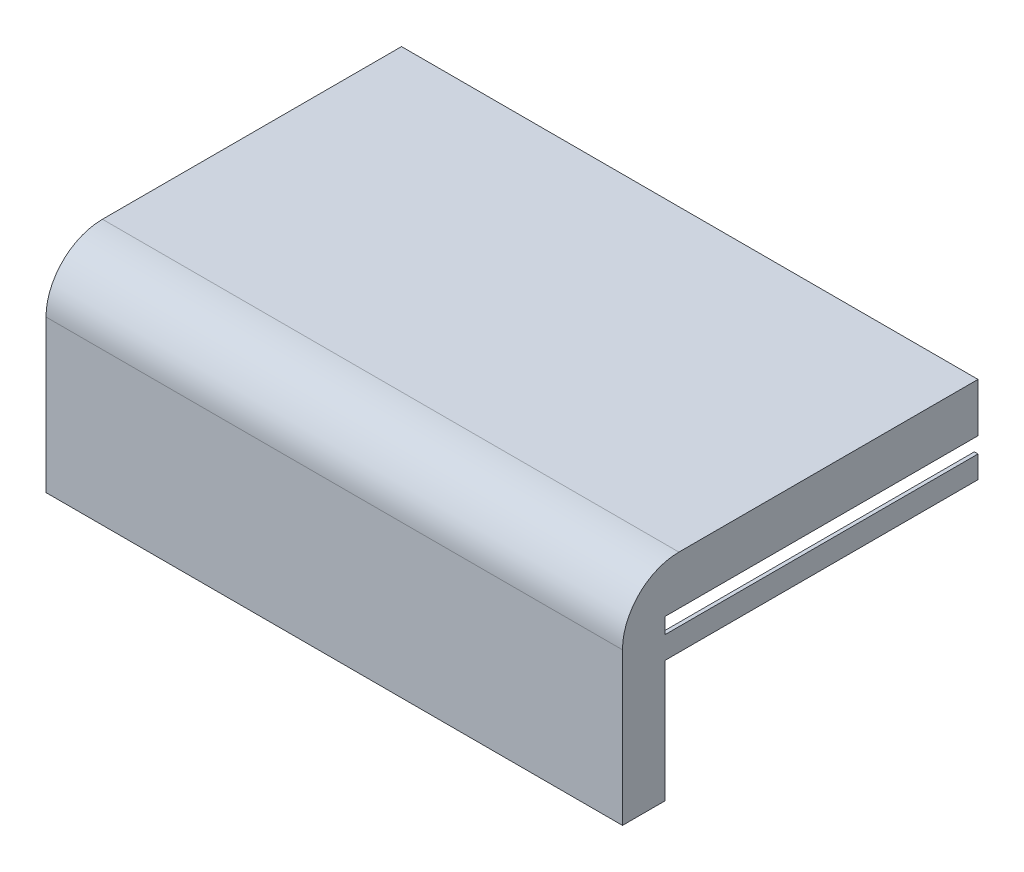
ISO-10303-21;
HEADER;
FILE_DESCRIPTION(('STEP AP214'),'2;1');
FILE_NAME('part.step','',(''),(''),'','','');
FILE_SCHEMA(('AUTOMOTIVE_DESIGN { 1 0 10303 214 1 1 1 1 }'));
ENDSEC;
DATA;
#1=APPLICATION_CONTEXT('core data for automotive mechanical design processes');
#2=APPLICATION_PROTOCOL_DEFINITION('international standard','automotive_design',2000,#1);
#3=PRODUCT_CONTEXT('',#1,'mechanical');
#4=PRODUCT('Part','Part','',(#3));
#5=PRODUCT_RELATED_PRODUCT_CATEGORY('part','',(#4));
#6=PRODUCT_DEFINITION_FORMATION('','',#4);
#7=PRODUCT_DEFINITION_CONTEXT('part definition',#1,'design');
#8=PRODUCT_DEFINITION('design','',#6,#7);
#9=PRODUCT_DEFINITION_SHAPE('','',#8);
#10=(LENGTH_UNIT() NAMED_UNIT(*) SI_UNIT(.MILLI.,.METRE.));
#11=(NAMED_UNIT(*) PLANE_ANGLE_UNIT() SI_UNIT($,.RADIAN.));
#12=(NAMED_UNIT(*) SI_UNIT($,.STERADIAN.) SOLID_ANGLE_UNIT());
#13=UNCERTAINTY_MEASURE_WITH_UNIT(LENGTH_MEASURE(1.E-05),#10,'distance_accuracy_value','');
#14=(GEOMETRIC_REPRESENTATION_CONTEXT(3) GLOBAL_UNCERTAINTY_ASSIGNED_CONTEXT((#13)) GLOBAL_UNIT_ASSIGNED_CONTEXT((#10,
#11,#12)) REPRESENTATION_CONTEXT('',''));
#15=CARTESIAN_POINT('',(0.,0.,0.));
#16=DIRECTION('',(0.,0.,1.));
#17=DIRECTION('',(1.,0.,0.));
#18=AXIS2_PLACEMENT_3D('',#15,#16,#17);
#19=CARTESIAN_POINT('',(-132.111662198391,-51.0167560321716,111.));
#20=DIRECTION('',(0.,0.,1.));
#21=DIRECTION('',(1.,0.,0.));
#22=AXIS2_PLACEMENT_3D('',#19,#20,#21);
#23=PLANE('',#22);
#24=DIRECTION('',(1.,0.,0.));
#25=VECTOR('',#24,1.);
#26=CARTESIAN_POINT('',(140.888337801609,-7.90780567356988,111.));
#27=LINE('',#26,#25);
#28=CARTESIAN_POINT('',(140.888337801609,-7.90780567356988,111.));
#29=VERTEX_POINT('',#28);
#30=CARTESIAN_POINT('',(142.188337801609,-7.90780567356988,111.));
#31=VERTEX_POINT('',#30);
#32=EDGE_CURVE('E137',#29,#31,#27,.T.);
#33=ORIENTED_EDGE('',*,*,#32,.T.);
#34=DIRECTION('',(0.,-1.,0.));
#35=VECTOR('',#34,1.);
#36=CARTESIAN_POINT('',(142.188337801609,-51.0167560321716,111.));
#37=LINE('',#36,#35);
#38=CARTESIAN_POINT('',(142.188337801609,-51.0167560321716,111.));
#39=VERTEX_POINT('',#38);
#40=EDGE_CURVE('E171',#31,#39,#37,.T.);
#41=ORIENTED_EDGE('',*,*,#40,.T.);
#42=DIRECTION('',(1.,0.,0.));
#43=VECTOR('',#42,1.);
#44=CARTESIAN_POINT('',(-132.111662198391,-51.0167560321716,111.));
#45=LINE('',#44,#43);
#46=CARTESIAN_POINT('',(-62.1116621983914,-51.0167560321716,111.));
#47=VERTEX_POINT('',#46);
#48=EDGE_CURVE('E176',#47,#39,#45,.T.);
#49=ORIENTED_EDGE('',*,*,#48,.F.);
#50=DIRECTION('',(0.,-1.,0.));
#51=VECTOR('',#50,1.);
#52=CARTESIAN_POINT('',(-62.1116621983914,22.8832439678284,111.));
#53=LINE('',#52,#51);
#54=CARTESIAN_POINT('',(-62.1116621983914,5.58324396782839,111.));
#55=VERTEX_POINT('',#54);
#56=EDGE_CURVE('E186',#55,#47,#53,.T.);
#57=ORIENTED_EDGE('',*,*,#56,.F.);
#58=DIRECTION('',(1.,0.,0.));
#59=VECTOR('',#58,1.);
#60=CARTESIAN_POINT('',(-132.111662198391,5.58324396782839,111.));
#61=LINE('',#60,#59);
#62=CARTESIAN_POINT('',(142.188337801609,5.58324396782839,111.));
#63=VERTEX_POINT('',#62);
#64=EDGE_CURVE('E175',#55,#63,#61,.T.);
#65=ORIENTED_EDGE('',*,*,#64,.T.);
#66=CARTESIAN_POINT('',(142.188337801609,0.,111.));
#67=VERTEX_POINT('',#66);
#68=EDGE_CURVE('E172',#63,#67,#37,.T.);
#69=ORIENTED_EDGE('',*,*,#68,.T.);
#70=DIRECTION('',(1.,0.,0.));
#71=VECTOR('',#70,1.);
#72=CARTESIAN_POINT('',(140.888337801609,0.,111.));
#73=LINE('',#72,#71);
#74=CARTESIAN_POINT('',(140.888337801609,0.,111.));
#75=VERTEX_POINT('',#74);
#76=EDGE_CURVE('E55',#75,#67,#73,.T.);
#77=ORIENTED_EDGE('',*,*,#76,.F.);
#78=DIRECTION('',(0.,1.,0.));
#79=VECTOR('',#78,1.);
#80=CARTESIAN_POINT('',(140.888337801609,0.,111.));
#81=LINE('',#80,#79);
#82=EDGE_CURVE('E59',#29,#75,#81,.T.);
#83=ORIENTED_EDGE('',*,*,#82,.F.);
#84=EDGE_LOOP('',(#33,#41,#49,#57,#65,#69,#77,#83));
#85=FACE_BOUND('',#84,.T.);
#86=ADVANCED_FACE('F39',(#85),#23,.F.);
#87=CARTESIAN_POINT('',(142.188337801609,2.8832439678284,106.));
#88=DIRECTION('',(-1.,0.,0.));
#89=DIRECTION('',(0.,0.,1.));
#90=AXIS2_PLACEMENT_3D('',#87,#88,#89);
#91=CYLINDRICAL_SURFACE('',#90,20.);
#92=DIRECTION('',(1.,0.,0.));
#93=VECTOR('',#92,1.);
#94=CARTESIAN_POINT('',(142.188337801609,22.8832439678284,106.));
#95=LINE('',#94,#93);
#96=CARTESIAN_POINT('',(-62.1116621983914,22.8832439678284,106.));
#97=VERTEX_POINT('',#96);
#98=CARTESIAN_POINT('',(142.188337801609,22.8832439678284,106.));
#99=VERTEX_POINT('',#98);
#100=EDGE_CURVE('E230',#97,#99,#95,.T.);
#101=ORIENTED_EDGE('',*,*,#100,.F.);
#102=CARTESIAN_POINT('',(-62.1116621983914,2.8832439678284,106.));
#103=DIRECTION('',(1.,0.,0.));
#104=DIRECTION('',(0.,0.,-1.));
#105=AXIS2_PLACEMENT_3D('',#102,#103,#104);
#106=CIRCLE('',#105,20.);
#107=CARTESIAN_POINT('',(-62.1116621983914,2.8832439678284,126.));
#108=VERTEX_POINT('',#107);
#109=EDGE_CURVE('E48',#108,#97,#106,.F.);
#110=ORIENTED_EDGE('',*,*,#109,.F.);
#111=DIRECTION('',(1.,0.,0.));
#112=VECTOR('',#111,1.);
#113=CARTESIAN_POINT('',(142.188337801609,2.8832439678284,126.));
#114=LINE('',#113,#112);
#115=CARTESIAN_POINT('',(142.188337801609,2.8832439678284,126.));
#116=VERTEX_POINT('',#115);
#117=EDGE_CURVE('E234',#116,#108,#114,.F.);
#118=ORIENTED_EDGE('',*,*,#117,.F.);
#119=CARTESIAN_POINT('',(142.188337801609,2.8832439678284,106.));
#120=DIRECTION('',(-1.,0.,0.));
#121=DIRECTION('',(0.,0.,1.));
#122=AXIS2_PLACEMENT_3D('',#119,#120,#121);
#123=CIRCLE('',#122,20.);
#124=EDGE_CURVE('E11',#99,#116,#123,.F.);
#125=ORIENTED_EDGE('',*,*,#124,.F.);
#126=EDGE_LOOP('',(#101,#110,#118,#125));
#127=FACE_BOUND('',#126,.T.);
#128=ADVANCED_FACE('F41',(#127),#91,.T.);
#129=CARTESIAN_POINT('',(142.188337801609,22.8832439678284,126.));
#130=DIRECTION('',(0.,-1.,0.));
#131=DIRECTION('',(0.,0.,-1.));
#132=AXIS2_PLACEMENT_3D('',#129,#130,#131);
#133=PLANE('',#132);
#134=DIRECTION('',(0.,0.,-1.));
#135=VECTOR('',#134,1.);
#136=CARTESIAN_POINT('',(-62.1116621983914,22.8832439678284,126.));
#137=LINE('',#136,#135);
#138=CARTESIAN_POINT('',(-62.1116621983914,22.8832439678284,0.));
#139=VERTEX_POINT('',#138);
#140=EDGE_CURVE('E223',#97,#139,#137,.T.);
#141=ORIENTED_EDGE('',*,*,#140,.F.);
#142=ORIENTED_EDGE('',*,*,#100,.T.);
#143=DIRECTION('',(0.,0.,-1.));
#144=VECTOR('',#143,1.);
#145=CARTESIAN_POINT('',(142.188337801609,22.8832439678284,126.));
#146=LINE('',#145,#144);
#147=CARTESIAN_POINT('',(142.188337801609,22.8832439678284,0.));
#148=VERTEX_POINT('',#147);
#149=EDGE_CURVE('E202',#99,#148,#146,.T.);
#150=ORIENTED_EDGE('',*,*,#149,.T.);
#151=DIRECTION('',(-1.,0.,0.));
#152=VECTOR('',#151,1.);
#153=CARTESIAN_POINT('',(142.188337801609,22.8832439678284,0.));
#154=LINE('',#153,#152);
#155=EDGE_CURVE('E190',#148,#139,#154,.T.);
#156=ORIENTED_EDGE('',*,*,#155,.T.);
#157=EDGE_LOOP('',(#141,#142,#150,#156));
#158=FACE_BOUND('',#157,.T.);
#159=ADVANCED_FACE('F249',(#158),#133,.F.);
#160=CARTESIAN_POINT('',(-62.1116621983914,22.8832439678284,126.));
#161=DIRECTION('',(1.,0.,0.));
#162=DIRECTION('',(0.,0.,-1.));
#163=AXIS2_PLACEMENT_3D('',#160,#161,#162);
#164=PLANE('',#163);
#165=DIRECTION('',(0.,-1.,0.));
#166=VECTOR('',#165,1.);
#167=CARTESIAN_POINT('',(-62.1116621983914,22.8832439678284,126.));
#168=LINE('',#167,#166);
#169=CARTESIAN_POINT('',(-62.1116621983914,-51.0167560321716,126.));
#170=VERTEX_POINT('',#169);
#171=EDGE_CURVE('E191',#108,#170,#168,.T.);
#172=ORIENTED_EDGE('',*,*,#171,.F.);
#173=ORIENTED_EDGE('',*,*,#109,.T.);
#174=ORIENTED_EDGE('',*,*,#140,.T.);
#175=DIRECTION('',(0.,-1.,0.));
#176=VECTOR('',#175,1.);
#177=CARTESIAN_POINT('',(-62.1116621983914,22.8832439678284,0.));
#178=LINE('',#177,#176);
#179=CARTESIAN_POINT('',(-62.1116621983914,5.58324396782841,0.));
#180=VERTEX_POINT('',#179);
#181=EDGE_CURVE('E206',#139,#180,#178,.T.);
#182=ORIENTED_EDGE('',*,*,#181,.T.);
#183=DIRECTION('',(0.,0.,1.));
#184=VECTOR('',#183,1.);
#185=CARTESIAN_POINT('',(-62.1116621983914,5.58324396782839,126.));
#186=LINE('',#185,#184);
#187=EDGE_CURVE('E180',#180,#55,#186,.T.);
#188=ORIENTED_EDGE('',*,*,#187,.T.);
#189=ORIENTED_EDGE('',*,*,#56,.T.);
#190=DIRECTION('',(0.,0.,-1.));
#191=VECTOR('',#190,1.);
#192=CARTESIAN_POINT('',(-62.1116621983914,-51.0167560321716,126.));
#193=LINE('',#192,#191);
#194=EDGE_CURVE('E219',#170,#47,#193,.T.);
#195=ORIENTED_EDGE('',*,*,#194,.F.);
#196=EDGE_LOOP('',(#172,#173,#174,#182,#188,#189,#195));
#197=FACE_BOUND('',#196,.T.);
#198=ADVANCED_FACE('F241',(#197),#164,.F.);
#199=CARTESIAN_POINT('',(-62.1116621983914,-51.0167560321716,126.));
#200=DIRECTION('',(0.,1.,0.));
#201=DIRECTION('',(0.,0.,1.));
#202=AXIS2_PLACEMENT_3D('',#199,#200,#201);
#203=PLANE('',#202);
#204=ORIENTED_EDGE('',*,*,#194,.T.);
#205=ORIENTED_EDGE('',*,*,#48,.T.);
#206=DIRECTION('',(0.,0.,-1.));
#207=VECTOR('',#206,1.);
#208=CARTESIAN_POINT('',(142.188337801609,-51.0167560321716,126.));
#209=LINE('',#208,#207);
#210=CARTESIAN_POINT('',(142.188337801609,-51.0167560321716,126.));
#211=VERTEX_POINT('',#210);
#212=EDGE_CURVE('E215',#211,#39,#209,.T.);
#213=ORIENTED_EDGE('',*,*,#212,.F.);
#214=DIRECTION('',(1.,0.,0.));
#215=VECTOR('',#214,1.);
#216=CARTESIAN_POINT('',(-62.1116621983914,-51.0167560321716,126.));
#217=LINE('',#216,#215);
#218=EDGE_CURVE('E194',#170,#211,#217,.T.);
#219=ORIENTED_EDGE('',*,*,#218,.F.);
#220=EDGE_LOOP('',(#204,#205,#213,#219));
#221=FACE_BOUND('',#220,.T.);
#222=ADVANCED_FACE('F261',(#221),#203,.F.);
#223=CARTESIAN_POINT('',(142.188337801609,-51.0167560321716,126.));
#224=DIRECTION('',(-1.,0.,0.));
#225=DIRECTION('',(0.,0.,1.));
#226=AXIS2_PLACEMENT_3D('',#223,#224,#225);
#227=PLANE('',#226);
#228=ORIENTED_EDGE('',*,*,#149,.F.);
#229=ORIENTED_EDGE('',*,*,#124,.T.);
#230=DIRECTION('',(0.,1.,0.));
#231=VECTOR('',#230,1.);
#232=CARTESIAN_POINT('',(142.188337801609,-51.0167560321716,126.));
#233=LINE('',#232,#231);
#234=EDGE_CURVE('E198',#211,#116,#233,.T.);
#235=ORIENTED_EDGE('',*,*,#234,.F.);
#236=ORIENTED_EDGE('',*,*,#212,.T.);
#237=ORIENTED_EDGE('',*,*,#40,.F.);
#238=DIRECTION('',(0.,0.,1.));
#239=VECTOR('',#238,1.);
#240=CARTESIAN_POINT('',(142.188337801609,-7.90780567356988,0.));
#241=LINE('',#240,#239);
#242=CARTESIAN_POINT('',(142.188337801609,-7.90780567356988,0.));
#243=VERTEX_POINT('',#242);
#244=EDGE_CURVE('E153',#243,#31,#241,.T.);
#245=ORIENTED_EDGE('',*,*,#244,.F.);
#246=DIRECTION('',(0.,1.,0.));
#247=VECTOR('',#246,1.);
#248=CARTESIAN_POINT('',(142.188337801609,0.,0.));
#249=LINE('',#248,#247);
#250=CARTESIAN_POINT('',(142.188337801609,0.,0.));
#251=VERTEX_POINT('',#250);
#252=EDGE_CURVE('E127',#243,#251,#249,.T.);
#253=ORIENTED_EDGE('',*,*,#252,.T.);
#254=DIRECTION('',(0.,0.,-1.));
#255=VECTOR('',#254,1.);
#256=CARTESIAN_POINT('',(142.188337801609,0.,0.));
#257=LINE('',#256,#255);
#258=EDGE_CURVE('E140',#67,#251,#257,.T.);
#259=ORIENTED_EDGE('',*,*,#258,.F.);
#260=ORIENTED_EDGE('',*,*,#68,.F.);
#261=DIRECTION('',(0.,0.,1.));
#262=VECTOR('',#261,1.);
#263=CARTESIAN_POINT('',(142.188337801609,5.58324396782841,0.));
#264=LINE('',#263,#262);
#265=CARTESIAN_POINT('',(142.188337801609,5.58324396782841,0.));
#266=VERTEX_POINT('',#265);
#267=EDGE_CURVE('E163',#266,#63,#264,.T.);
#268=ORIENTED_EDGE('',*,*,#267,.F.);
#269=DIRECTION('',(0.,1.,0.));
#270=VECTOR('',#269,1.);
#271=CARTESIAN_POINT('',(142.188337801609,-51.0167560321716,0.));
#272=LINE('',#271,#270);
#273=EDGE_CURVE('E195',#266,#148,#272,.T.);
#274=ORIENTED_EDGE('',*,*,#273,.T.);
#275=EDGE_LOOP('',(#228,#229,#235,#236,#237,#245,#253,#259,#260,#268,#274));
#276=FACE_BOUND('',#275,.T.);
#277=ADVANCED_FACE('F265',(#276),#227,.F.);
#278=CARTESIAN_POINT('',(0.,0.,126.));
#279=DIRECTION('',(0.,0.,1.));
#280=DIRECTION('',(1.,0.,0.));
#281=AXIS2_PLACEMENT_3D('',#278,#279,#280);
#282=PLANE('',#281);
#283=ORIENTED_EDGE('',*,*,#234,.T.);
#284=ORIENTED_EDGE('',*,*,#117,.T.);
#285=ORIENTED_EDGE('',*,*,#171,.T.);
#286=ORIENTED_EDGE('',*,*,#218,.T.);
#287=EDGE_LOOP('',(#283,#284,#285,#286));
#288=FACE_BOUND('',#287,.T.);
#289=ADVANCED_FACE('F267',(#288),#282,.T.);
#290=CARTESIAN_POINT('',(0.,0.,0.));
#291=DIRECTION('',(0.,0.,1.));
#292=DIRECTION('',(1.,0.,0.));
#293=AXIS2_PLACEMENT_3D('',#290,#291,#292);
#294=PLANE('',#293);
#295=ORIENTED_EDGE('',*,*,#273,.F.);
#296=DIRECTION('',(-1.,0.,0.));
#297=VECTOR('',#296,1.);
#298=CARTESIAN_POINT('',(0.,5.58324396782841,0.));
#299=LINE('',#298,#297);
#300=EDGE_CURVE('E226',#266,#180,#299,.T.);
#301=ORIENTED_EDGE('',*,*,#300,.T.);
#302=ORIENTED_EDGE('',*,*,#181,.F.);
#303=ORIENTED_EDGE('',*,*,#155,.F.);
#304=EDGE_LOOP('',(#295,#301,#302,#303));
#305=FACE_BOUND('',#304,.T.);
#306=ADVANCED_FACE('F253',(#305),#294,.F.);
#307=CARTESIAN_POINT('',(-132.111662198391,5.58324396782841,0.));
#308=DIRECTION('',(0.,1.,0.));
#309=DIRECTION('',(0.,0.,1.));
#310=AXIS2_PLACEMENT_3D('',#307,#308,#309);
#311=PLANE('',#310);
#312=ORIENTED_EDGE('',*,*,#300,.F.);
#313=ORIENTED_EDGE('',*,*,#267,.T.);
#314=ORIENTED_EDGE('',*,*,#64,.F.);
#315=ORIENTED_EDGE('',*,*,#187,.F.);
#316=EDGE_LOOP('',(#312,#313,#314,#315));
#317=FACE_BOUND('',#316,.T.);
#318=ADVANCED_FACE('F256',(#317),#311,.F.);
#319=CARTESIAN_POINT('',(140.888337801609,-7.90780567356988,0.));
#320=DIRECTION('',(0.,1.,0.));
#321=DIRECTION('',(0.,0.,1.));
#322=AXIS2_PLACEMENT_3D('',#319,#320,#321);
#323=PLANE('',#322);
#324=ORIENTED_EDGE('',*,*,#244,.T.);
#325=ORIENTED_EDGE('',*,*,#32,.F.);
#326=DIRECTION('',(0.,0.,1.));
#327=VECTOR('',#326,1.);
#328=CARTESIAN_POINT('',(140.888337801609,-7.90780567356988,0.));
#329=LINE('',#328,#327);
#330=CARTESIAN_POINT('',(140.888337801609,-7.90780567356988,0.));
#331=VERTEX_POINT('',#330);
#332=EDGE_CURVE('E135',#331,#29,#329,.T.);
#333=ORIENTED_EDGE('',*,*,#332,.F.);
#334=DIRECTION('',(1.,0.,0.));
#335=VECTOR('',#334,1.);
#336=CARTESIAN_POINT('',(140.888337801609,-7.90780567356988,0.));
#337=LINE('',#336,#335);
#338=EDGE_CURVE('E121',#331,#243,#337,.T.);
#339=ORIENTED_EDGE('',*,*,#338,.T.);
#340=EDGE_LOOP('',(#324,#325,#333,#339));
#341=FACE_BOUND('',#340,.T.);
#342=ADVANCED_FACE('F136',(#341),#323,.F.);
#343=CARTESIAN_POINT('',(140.888337801609,0.,0.));
#344=DIRECTION('',(0.,-1.,0.));
#345=DIRECTION('',(0.,0.,-1.));
#346=AXIS2_PLACEMENT_3D('',#343,#344,#345);
#347=PLANE('',#346);
#348=ORIENTED_EDGE('',*,*,#258,.T.);
#349=DIRECTION('',(1.,0.,0.));
#350=VECTOR('',#349,1.);
#351=CARTESIAN_POINT('',(140.888337801609,0.,0.));
#352=LINE('',#351,#350);
#353=CARTESIAN_POINT('',(140.888337801609,0.,0.));
#354=VERTEX_POINT('',#353);
#355=EDGE_CURVE('E132',#354,#251,#352,.T.);
#356=ORIENTED_EDGE('',*,*,#355,.F.);
#357=DIRECTION('',(0.,0.,-1.));
#358=VECTOR('',#357,1.);
#359=CARTESIAN_POINT('',(140.888337801609,0.,0.));
#360=LINE('',#359,#358);
#361=EDGE_CURVE('E144',#75,#354,#360,.T.);
#362=ORIENTED_EDGE('',*,*,#361,.F.);
#363=ORIENTED_EDGE('',*,*,#76,.T.);
#364=EDGE_LOOP('',(#348,#356,#362,#363));
#365=FACE_BOUND('',#364,.T.);
#366=ADVANCED_FACE('F288',(#365),#347,.F.);
#367=CARTESIAN_POINT('',(140.888337801609,0.,0.));
#368=DIRECTION('',(0.,0.,-1.));
#369=DIRECTION('',(-1.,0.,0.));
#370=AXIS2_PLACEMENT_3D('',#367,#368,#369);
#371=PLANE('',#370);
#372=ORIENTED_EDGE('',*,*,#252,.F.);
#373=ORIENTED_EDGE('',*,*,#338,.F.);
#374=DIRECTION('',(0.,1.,0.));
#375=VECTOR('',#374,1.);
#376=CARTESIAN_POINT('',(140.888337801609,0.,0.));
#377=LINE('',#376,#375);
#378=EDGE_CURVE('E125',#331,#354,#377,.T.);
#379=ORIENTED_EDGE('',*,*,#378,.T.);
#380=ORIENTED_EDGE('',*,*,#355,.T.);
#381=EDGE_LOOP('',(#372,#373,#379,#380));
#382=FACE_BOUND('',#381,.T.);
#383=ADVANCED_FACE('F123',(#382),#371,.T.);
#384=CARTESIAN_POINT('',(140.888337801609,0.,0.));
#385=DIRECTION('',(1.,0.,0.));
#386=DIRECTION('',(0.,0.,-1.));
#387=AXIS2_PLACEMENT_3D('',#384,#385,#386);
#388=PLANE('',#387);
#389=ORIENTED_EDGE('',*,*,#332,.T.);
#390=ORIENTED_EDGE('',*,*,#82,.T.);
#391=ORIENTED_EDGE('',*,*,#361,.T.);
#392=ORIENTED_EDGE('',*,*,#378,.F.);
#393=EDGE_LOOP('',(#389,#390,#391,#392));
#394=FACE_BOUND('',#393,.T.);
#395=ADVANCED_FACE('F142',(#394),#388,.F.);
#396=CLOSED_SHELL('',(#86,#128,#159,#198,#222,#277,#289,#306,#318,#342,#366,#383,#395));
#397=MANIFOLD_SOLID_BREP('B2',#396);
#398=ADVANCED_BREP_SHAPE_REPRESENTATION('',(#18,#397),#14);
#399=SHAPE_DEFINITION_REPRESENTATION(#9,#398);
ENDSEC;
END-ISO-10303-21;
